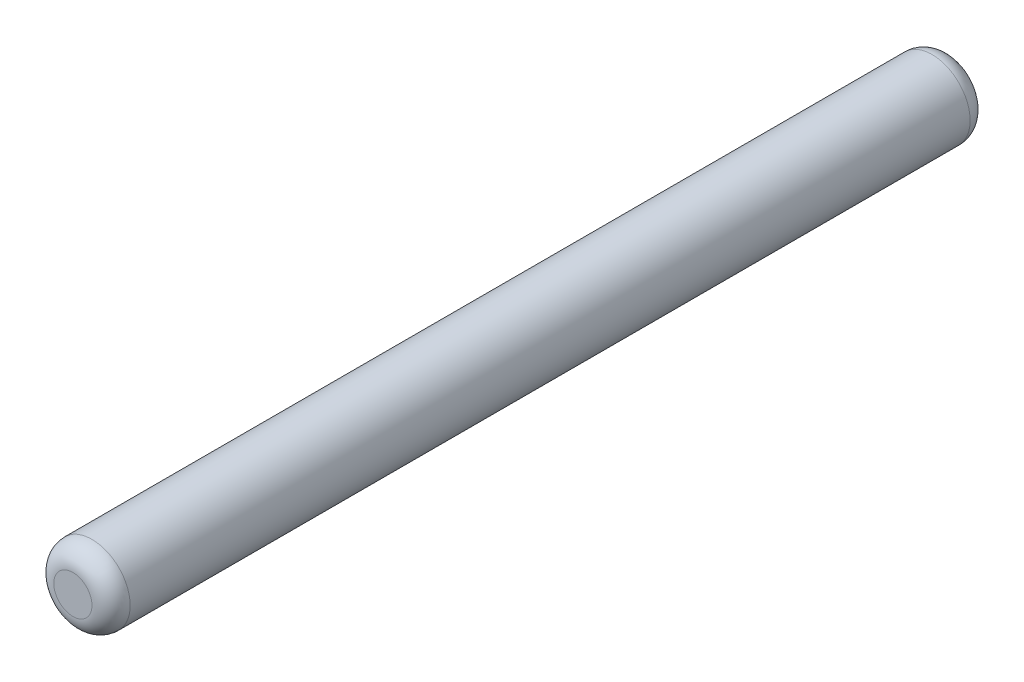
ISO-10303-21;
HEADER;
FILE_DESCRIPTION(('STEP AP214'),'2;1');
FILE_NAME('part.step','',(''),(''),'','','');
FILE_SCHEMA(('AUTOMOTIVE_DESIGN { 1 0 10303 214 1 1 1 1 }'));
ENDSEC;
DATA;
#1=APPLICATION_CONTEXT('core data for automotive mechanical design processes');
#2=APPLICATION_PROTOCOL_DEFINITION('international standard','automotive_design',2000,#1);
#3=PRODUCT_CONTEXT('',#1,'mechanical');
#4=PRODUCT('Part','Part','',(#3));
#5=PRODUCT_RELATED_PRODUCT_CATEGORY('part','',(#4));
#6=PRODUCT_DEFINITION_FORMATION('','',#4);
#7=PRODUCT_DEFINITION_CONTEXT('part definition',#1,'design');
#8=PRODUCT_DEFINITION('design','',#6,#7);
#9=PRODUCT_DEFINITION_SHAPE('','',#8);
#10=(LENGTH_UNIT() NAMED_UNIT(*) SI_UNIT(.MILLI.,.METRE.));
#11=(NAMED_UNIT(*) PLANE_ANGLE_UNIT() SI_UNIT($,.RADIAN.));
#12=(NAMED_UNIT(*) SI_UNIT($,.STERADIAN.) SOLID_ANGLE_UNIT());
#13=UNCERTAINTY_MEASURE_WITH_UNIT(LENGTH_MEASURE(1.E-05),#10,'distance_accuracy_value','');
#14=(GEOMETRIC_REPRESENTATION_CONTEXT(3) GLOBAL_UNCERTAINTY_ASSIGNED_CONTEXT((#13)) GLOBAL_UNIT_ASSIGNED_CONTEXT((#10,
#11,#12)) REPRESENTATION_CONTEXT('',''));
#15=CARTESIAN_POINT('',(0.,0.,0.));
#16=DIRECTION('',(0.,0.,1.));
#17=DIRECTION('',(1.,0.,0.));
#18=AXIS2_PLACEMENT_3D('',#15,#16,#17);
#19=CARTESIAN_POINT('',(0.,0.,-11.5));
#20=DIRECTION('',(0.,0.,1.));
#21=DIRECTION('',(1.,0.,0.));
#22=AXIS2_PLACEMENT_3D('',#19,#20,#21);
#23=CYLINDRICAL_SURFACE('',#22,1.);
#24=CARTESIAN_POINT('',(0.,0.,-11.));
#25=DIRECTION('',(0.,0.,1.));
#26=DIRECTION('',(1.,0.,0.));
#27=AXIS2_PLACEMENT_3D('',#24,#25,#26);
#28=CIRCLE('',#27,1.);
#29=CARTESIAN_POINT('',(1.,0.,-11.));
#30=VERTEX_POINT('',#29);
#31=EDGE_CURVE('E20',#30,#30,#28,.T.);
#32=ORIENTED_EDGE('',*,*,#31,.T.);
#33=EDGE_LOOP('',(#32));
#34=FACE_BOUND('',#33,.T.);
#35=CARTESIAN_POINT('',(0.,0.,11.));
#36=DIRECTION('',(0.,0.,-1.));
#37=DIRECTION('',(1.,-1.97175609173428E-13,0.));
#38=AXIS2_PLACEMENT_3D('',#35,#36,#37);
#39=CIRCLE('',#38,1.);
#40=CARTESIAN_POINT('',(1.,-1.97175609173428E-13,11.));
#41=VERTEX_POINT('',#40);
#42=EDGE_CURVE('E11',#41,#41,#39,.T.);
#43=ORIENTED_EDGE('',*,*,#42,.T.);
#44=EDGE_LOOP('',(#43));
#45=FACE_BOUND('',#44,.T.);
#46=ADVANCED_FACE('F16',(#34,#45),#23,.T.);
#47=CARTESIAN_POINT('',(0.,1.965726301352E-13,11.0000000000053));
#48=DIRECTION('',(0.,0.,1.));
#49=DIRECTION('',(1.,0.,0.));
#50=AXIS2_PLACEMENT_3D('',#47,#48,#49);
#51=TOROIDAL_SURFACE('',#50,0.499999999998859,0.499999999997896);
#52=ORIENTED_EDGE('',*,*,#42,.F.);
#53=EDGE_LOOP('',(#52));
#54=FACE_BOUND('',#53,.T.);
#55=CARTESIAN_POINT('',(0.,1.965726301352E-13,11.5000000000032));
#56=DIRECTION('',(0.,0.,-1.));
#57=DIRECTION('',(1.,0.,0.));
#58=AXIS2_PLACEMENT_3D('',#55,#56,#57);
#59=CIRCLE('',#58,0.499999999999934);
#60=CARTESIAN_POINT('',(0.5,1.965726301352E-13,11.5000000000032));
#61=VERTEX_POINT('',#60);
#62=EDGE_CURVE('E52',#61,#61,#59,.T.);
#63=ORIENTED_EDGE('',*,*,#62,.T.);
#64=EDGE_LOOP('',(#63));
#65=FACE_BOUND('',#64,.T.);
#66=ADVANCED_FACE('F53',(#54,#65),#51,.T.);
#67=CARTESIAN_POINT('',(-1.55257751099924E-13,0.,-11.0000000000049));
#68=DIRECTION('',(0.,0.,1.));
#69=DIRECTION('',(1.,0.,0.));
#70=AXIS2_PLACEMENT_3D('',#67,#68,#69);
#71=TOROIDAL_SURFACE('',#70,0.499999999998702,0.499999999998066);
#72=CARTESIAN_POINT('',(-1.49288197365878E-13,0.,-11.5000000000029));
#73=DIRECTION('',(0.,0.,1.));
#74=DIRECTION('',(1.,0.,0.));
#75=AXIS2_PLACEMENT_3D('',#72,#73,#74);
#76=CIRCLE('',#75,0.499999999999851);
#77=CARTESIAN_POINT('',(0.499999999999701,0.,-11.5000000000029));
#78=VERTEX_POINT('',#77);
#79=EDGE_CURVE('E45',#78,#78,#76,.T.);
#80=ORIENTED_EDGE('',*,*,#79,.T.);
#81=EDGE_LOOP('',(#80));
#82=FACE_BOUND('',#81,.T.);
#83=ORIENTED_EDGE('',*,*,#31,.F.);
#84=EDGE_LOOP('',(#83));
#85=FACE_BOUND('',#84,.T.);
#86=ADVANCED_FACE('F84',(#82,#85),#71,.T.);
#87=CARTESIAN_POINT('',(0.,0.,11.5));
#88=DIRECTION('',(0.,0.,1.));
#89=DIRECTION('',(1.,0.,0.));
#90=AXIS2_PLACEMENT_3D('',#87,#88,#89);
#91=PLANE('',#90);
#92=ORIENTED_EDGE('',*,*,#62,.F.);
#93=EDGE_LOOP('',(#92));
#94=FACE_BOUND('',#93,.T.);
#95=ADVANCED_FACE('F18',(#94),#91,.T.);
#96=CARTESIAN_POINT('',(0.,0.,-11.5));
#97=DIRECTION('',(0.,0.,1.));
#98=DIRECTION('',(1.,0.,0.));
#99=AXIS2_PLACEMENT_3D('',#96,#97,#98);
#100=PLANE('',#99);
#101=ORIENTED_EDGE('',*,*,#79,.F.);
#102=EDGE_LOOP('',(#101));
#103=FACE_BOUND('',#102,.T.);
#104=ADVANCED_FACE('F100',(#103),#100,.F.);
#105=CLOSED_SHELL('',(#46,#66,#86,#95,#104));
#106=MANIFOLD_SOLID_BREP('B1',#105);
#107=ADVANCED_BREP_SHAPE_REPRESENTATION('',(#18,#106),#14);
#108=SHAPE_DEFINITION_REPRESENTATION(#9,#107);
ENDSEC;
END-ISO-10303-21;
